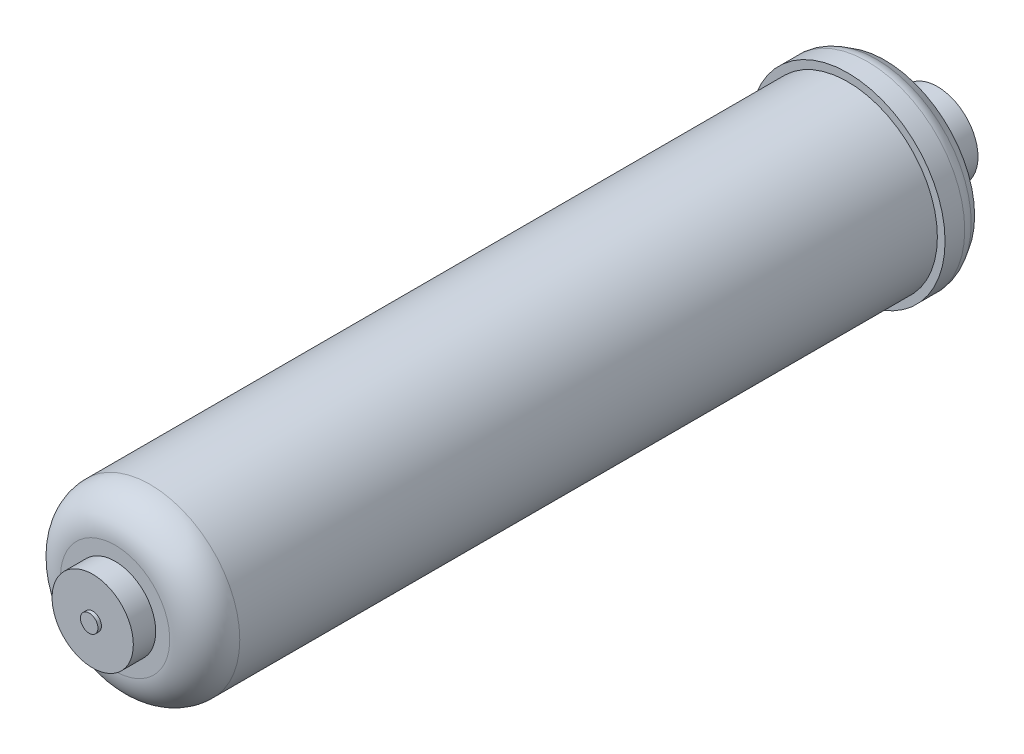
ISO-10303-21;
HEADER;
FILE_DESCRIPTION(('STEP AP214'),'2;1');
FILE_NAME('part.step','',(''),(''),'','','');
FILE_SCHEMA(('AUTOMOTIVE_DESIGN { 1 0 10303 214 1 1 1 1 }'));
ENDSEC;
DATA;
#1=APPLICATION_CONTEXT('core data for automotive mechanical design processes');
#2=APPLICATION_PROTOCOL_DEFINITION('international standard','automotive_design',2000,#1);
#3=PRODUCT_CONTEXT('',#1,'mechanical');
#4=PRODUCT('Part','Part','',(#3));
#5=PRODUCT_RELATED_PRODUCT_CATEGORY('part','',(#4));
#6=PRODUCT_DEFINITION_FORMATION('','',#4);
#7=PRODUCT_DEFINITION_CONTEXT('part definition',#1,'design');
#8=PRODUCT_DEFINITION('design','',#6,#7);
#9=PRODUCT_DEFINITION_SHAPE('','',#8);
#10=(LENGTH_UNIT() NAMED_UNIT(*) SI_UNIT(.MILLI.,.METRE.));
#11=(NAMED_UNIT(*) PLANE_ANGLE_UNIT() SI_UNIT($,.RADIAN.));
#12=(NAMED_UNIT(*) SI_UNIT($,.STERADIAN.) SOLID_ANGLE_UNIT());
#13=UNCERTAINTY_MEASURE_WITH_UNIT(LENGTH_MEASURE(1.E-05),#10,'distance_accuracy_value','');
#14=(GEOMETRIC_REPRESENTATION_CONTEXT(3) GLOBAL_UNCERTAINTY_ASSIGNED_CONTEXT((#13)) GLOBAL_UNIT_ASSIGNED_CONTEXT((#10,
#11,#12)) REPRESENTATION_CONTEXT('',''));
#15=CARTESIAN_POINT('',(0.,0.,0.));
#16=DIRECTION('',(0.,0.,1.));
#17=DIRECTION('',(1.,0.,0.));
#18=AXIS2_PLACEMENT_3D('',#15,#16,#17);
#19=CARTESIAN_POINT('',(0.,0.,0.));
#20=DIRECTION('',(0.,0.,-1.));
#21=DIRECTION('',(-1.,0.,0.));
#22=AXIS2_PLACEMENT_3D('',#19,#20,#21);
#23=PLANE('',#22);
#24=CARTESIAN_POINT('',(0.,0.,0.));
#25=DIRECTION('',(0.,0.,1.));
#26=DIRECTION('',(1.,0.,0.));
#27=AXIS2_PLACEMENT_3D('',#24,#25,#26);
#28=CIRCLE('',#27,3.175);
#29=CARTESIAN_POINT('',(3.175,0.,0.));
#30=VERTEX_POINT('',#29);
#31=EDGE_CURVE('E52',#30,#30,#28,.T.);
#32=ORIENTED_EDGE('',*,*,#31,.T.);
#33=EDGE_LOOP('',(#32));
#34=FACE_BOUND('',#33,.T.);
#35=ADVANCED_FACE('F32',(#34),#23,.F.);
#36=CARTESIAN_POINT('',(0.,0.,0.));
#37=DIRECTION('',(0.,0.,1.));
#38=DIRECTION('',(1.,0.,0.));
#39=AXIS2_PLACEMENT_3D('',#36,#37,#38);
#40=CYLINDRICAL_SURFACE('',#39,3.175);
#41=ORIENTED_EDGE('',*,*,#31,.F.);
#42=EDGE_LOOP('',(#41));
#43=FACE_BOUND('',#42,.T.);
#44=CARTESIAN_POINT('',(0.,0.,-1.27));
#45=DIRECTION('',(0.,0.,1.));
#46=DIRECTION('',(1.,0.,0.));
#47=AXIS2_PLACEMENT_3D('',#44,#45,#46);
#48=CIRCLE('',#47,3.175);
#49=CARTESIAN_POINT('',(3.175,0.,-1.27));
#50=VERTEX_POINT('',#49);
#51=EDGE_CURVE('E55',#50,#50,#48,.T.);
#52=ORIENTED_EDGE('',*,*,#51,.T.);
#53=EDGE_LOOP('',(#52));
#54=FACE_BOUND('',#53,.T.);
#55=ADVANCED_FACE('F101',(#43,#54),#40,.T.);
#56=CARTESIAN_POINT('',(0.,3.175,-1.27));
#57=DIRECTION('',(0.,0.,-1.));
#58=DIRECTION('',(-1.,0.,0.));
#59=AXIS2_PLACEMENT_3D('',#56,#57,#58);
#60=PLANE('',#59);
#61=ORIENTED_EDGE('',*,*,#51,.F.);
#62=EDGE_LOOP('',(#61));
#63=FACE_BOUND('',#62,.T.);
#64=CARTESIAN_POINT('',(0.,0.,-1.27));
#65=DIRECTION('',(0.,0.,1.));
#66=DIRECTION('',(1.,0.,0.));
#67=AXIS2_PLACEMENT_3D('',#64,#65,#66);
#68=CIRCLE('',#67,14.732);
#69=CARTESIAN_POINT('',(14.732,0.,-1.27));
#70=VERTEX_POINT('',#69);
#71=EDGE_CURVE('E58',#70,#70,#68,.T.);
#72=ORIENTED_EDGE('',*,*,#71,.T.);
#73=EDGE_LOOP('',(#72));
#74=FACE_BOUND('',#73,.T.);
#75=ADVANCED_FACE('F107',(#63,#74),#60,.F.);
#76=CARTESIAN_POINT('',(0.,0.,0.));
#77=DIRECTION('',(0.,0.,1.));
#78=DIRECTION('',(1.,0.,0.));
#79=AXIS2_PLACEMENT_3D('',#76,#77,#78);
#80=CYLINDRICAL_SURFACE('',#79,14.732);
#81=ORIENTED_EDGE('',*,*,#71,.F.);
#82=EDGE_LOOP('',(#81));
#83=FACE_BOUND('',#82,.T.);
#84=CARTESIAN_POINT('',(0.,0.,-9.398));
#85=DIRECTION('',(0.,0.,1.));
#86=DIRECTION('',(1.,0.,0.));
#87=AXIS2_PLACEMENT_3D('',#84,#85,#86);
#88=CIRCLE('',#87,14.732);
#89=CARTESIAN_POINT('',(14.732,0.,-9.398));
#90=VERTEX_POINT('',#89);
#91=EDGE_CURVE('E61',#90,#90,#88,.T.);
#92=ORIENTED_EDGE('',*,*,#91,.T.);
#93=EDGE_LOOP('',(#92));
#94=FACE_BOUND('',#93,.T.);
#95=ADVANCED_FACE('F113',(#83,#94),#80,.T.);
#96=CARTESIAN_POINT('',(0.,14.732,-9.398));
#97=DIRECTION('',(0.,0.,-1.));
#98=DIRECTION('',(-1.,0.,0.));
#99=AXIS2_PLACEMENT_3D('',#96,#97,#98);
#100=PLANE('',#99);
#101=CARTESIAN_POINT('',(0.,0.,-9.398));
#102=DIRECTION('',(0.,0.,-1.));
#103=DIRECTION('',(-1.,0.,0.));
#104=AXIS2_PLACEMENT_3D('',#101,#102,#103);
#105=CIRCLE('',#104,19.812);
#106=CARTESIAN_POINT('',(-19.812,0.,-9.398));
#107=VERTEX_POINT('',#106);
#108=EDGE_CURVE('E47',#107,#107,#105,.F.);
#109=ORIENTED_EDGE('',*,*,#108,.T.);
#110=EDGE_LOOP('',(#109));
#111=FACE_BOUND('',#110,.T.);
#112=ORIENTED_EDGE('',*,*,#91,.F.);
#113=EDGE_LOOP('',(#112));
#114=FACE_BOUND('',#113,.T.);
#115=ADVANCED_FACE('F117',(#111,#114),#100,.F.);
#116=CARTESIAN_POINT('',(0.,0.,0.));
#117=DIRECTION('',(0.,0.,1.));
#118=DIRECTION('',(1.,0.,0.));
#119=AXIS2_PLACEMENT_3D('',#116,#117,#118);
#120=CYLINDRICAL_SURFACE('',#119,32.512);
#121=CARTESIAN_POINT('',(0.,0.,-22.098));
#122=DIRECTION('',(0.,0.,-1.));
#123=DIRECTION('',(-1.,0.,0.));
#124=AXIS2_PLACEMENT_3D('',#121,#122,#123);
#125=CIRCLE('',#124,32.512);
#126=CARTESIAN_POINT('',(-32.512,0.,-22.098));
#127=VERTEX_POINT('',#126);
#128=EDGE_CURVE('E43',#127,#127,#125,.T.);
#129=ORIENTED_EDGE('',*,*,#128,.T.);
#130=EDGE_LOOP('',(#129));
#131=FACE_BOUND('',#130,.T.);
#132=CARTESIAN_POINT('',(0.,0.,-275.082));
#133=DIRECTION('',(0.,0.,1.));
#134=DIRECTION('',(1.,0.,0.));
#135=AXIS2_PLACEMENT_3D('',#132,#133,#134);
#136=CIRCLE('',#135,32.512);
#137=CARTESIAN_POINT('',(32.512,0.,-275.082));
#138=VERTEX_POINT('',#137);
#139=EDGE_CURVE('E64',#138,#138,#136,.T.);
#140=ORIENTED_EDGE('',*,*,#139,.T.);
#141=EDGE_LOOP('',(#140));
#142=FACE_BOUND('',#141,.T.);
#143=ADVANCED_FACE('F121',(#131,#142),#120,.T.);
#144=CARTESIAN_POINT('',(0.,32.512,-275.082));
#145=DIRECTION('',(0.,0.,-1.));
#146=DIRECTION('',(-1.,0.,0.));
#147=AXIS2_PLACEMENT_3D('',#144,#145,#146);
#148=PLANE('',#147);
#149=ORIENTED_EDGE('',*,*,#139,.F.);
#150=EDGE_LOOP('',(#149));
#151=FACE_BOUND('',#150,.T.);
#152=CARTESIAN_POINT('',(0.,0.,-275.082));
#153=DIRECTION('',(0.,0.,1.));
#154=DIRECTION('',(1.,0.,0.));
#155=AXIS2_PLACEMENT_3D('',#152,#153,#154);
#156=CIRCLE('',#155,35.306);
#157=CARTESIAN_POINT('',(35.306,0.,-275.082));
#158=VERTEX_POINT('',#157);
#159=EDGE_CURVE('E67',#158,#158,#156,.T.);
#160=ORIENTED_EDGE('',*,*,#159,.T.);
#161=EDGE_LOOP('',(#160));
#162=FACE_BOUND('',#161,.T.);
#163=ADVANCED_FACE('F125',(#151,#162),#148,.F.);
#164=CARTESIAN_POINT('',(0.,0.,0.));
#165=DIRECTION('',(0.,0.,1.));
#166=DIRECTION('',(1.,0.,0.));
#167=AXIS2_PLACEMENT_3D('',#164,#165,#166);
#168=CYLINDRICAL_SURFACE('',#167,35.306);
#169=CARTESIAN_POINT('',(0.,0.,-282.2089120975));
#170=DIRECTION('',(0.,0.,-1.));
#171=DIRECTION('',(-1.,0.,0.));
#172=AXIS2_PLACEMENT_3D('',#169,#170,#171);
#173=CIRCLE('',#172,35.306);
#174=CARTESIAN_POINT('',(-35.306,0.,-282.2089120975));
#175=VERTEX_POINT('',#174);
#176=EDGE_CURVE('E39',#175,#175,#173,.F.);
#177=ORIENTED_EDGE('',*,*,#176,.T.);
#178=EDGE_LOOP('',(#177));
#179=FACE_BOUND('',#178,.T.);
#180=ORIENTED_EDGE('',*,*,#159,.F.);
#181=EDGE_LOOP('',(#180));
#182=FACE_BOUND('',#181,.T.);
#183=ADVANCED_FACE('F129',(#179,#182),#168,.T.);
#184=CARTESIAN_POINT('',(0.,0.,-288.544));
#185=DIRECTION('',(0.,0.,1.));
#186=DIRECTION('',(1.,0.,0.));
#187=AXIS2_PLACEMENT_3D('',#184,#185,#186);
#188=CONICAL_SURFACE('',#187,32.5550841268207,0.541659485455934);
#189=CARTESIAN_POINT('',(0.,0.,-285.482709449718));
#190=DIRECTION('',(0.,0.,-1.));
#191=DIRECTION('',(-1.,0.,0.));
#192=AXIS2_PLACEMENT_3D('',#189,#190,#191);
#193=CIRCLE('',#192,34.3970248020577);
#194=CARTESIAN_POINT('',(-34.3970248020577,0.,-285.482709449718));
#195=VERTEX_POINT('',#194);
#196=EDGE_CURVE('E10',#195,#195,#193,.T.);
#197=ORIENTED_EDGE('',*,*,#196,.T.);
#198=EDGE_LOOP('',(#197));
#199=FACE_BOUND('',#198,.T.);
#200=CARTESIAN_POINT('',(0.,0.,-288.544));
#201=DIRECTION('',(0.,0.,1.));
#202=DIRECTION('',(1.,0.,0.));
#203=AXIS2_PLACEMENT_3D('',#200,#201,#202);
#204=CIRCLE('',#203,32.5550841268207);
#205=CARTESIAN_POINT('',(32.5550841268207,0.,-288.544));
#206=VERTEX_POINT('',#205);
#207=EDGE_CURVE('E70',#206,#206,#204,.T.);
#208=ORIENTED_EDGE('',*,*,#207,.T.);
#209=EDGE_LOOP('',(#208));
#210=FACE_BOUND('',#209,.T.);
#211=ADVANCED_FACE('F133',(#199,#210),#188,.T.);
#212=CARTESIAN_POINT('',(0.,0.,-299.466));
#213=DIRECTION('',(0.,0.,1.));
#214=DIRECTION('',(1.,0.,0.));
#215=AXIS2_PLACEMENT_3D('',#212,#213,#214);
#216=CONICAL_SURFACE('',#215,14.732,1.02101761241668);
#217=ORIENTED_EDGE('',*,*,#207,.F.);
#218=EDGE_LOOP('',(#217));
#219=FACE_BOUND('',#218,.T.);
#220=CARTESIAN_POINT('',(0.,0.,-299.466));
#221=DIRECTION('',(0.,0.,1.));
#222=DIRECTION('',(1.,0.,0.));
#223=AXIS2_PLACEMENT_3D('',#220,#221,#222);
#224=CIRCLE('',#223,14.732);
#225=CARTESIAN_POINT('',(14.732,0.,-299.466));
#226=VERTEX_POINT('',#225);
#227=EDGE_CURVE('E73',#226,#226,#224,.T.);
#228=ORIENTED_EDGE('',*,*,#227,.T.);
#229=EDGE_LOOP('',(#228));
#230=FACE_BOUND('',#229,.T.);
#231=ADVANCED_FACE('F136',(#219,#230),#216,.T.);
#232=CARTESIAN_POINT('',(0.,0.,0.));
#233=DIRECTION('',(0.,0.,1.));
#234=DIRECTION('',(1.,0.,0.));
#235=AXIS2_PLACEMENT_3D('',#232,#233,#234);
#236=CYLINDRICAL_SURFACE('',#235,14.732);
#237=ORIENTED_EDGE('',*,*,#227,.F.);
#238=EDGE_LOOP('',(#237));
#239=FACE_BOUND('',#238,.T.);
#240=CARTESIAN_POINT('',(0.,0.,-307.594));
#241=DIRECTION('',(0.,0.,1.));
#242=DIRECTION('',(1.,0.,0.));
#243=AXIS2_PLACEMENT_3D('',#240,#241,#242);
#244=CIRCLE('',#243,14.732);
#245=CARTESIAN_POINT('',(14.732,0.,-307.594));
#246=VERTEX_POINT('',#245);
#247=EDGE_CURVE('E76',#246,#246,#244,.T.);
#248=ORIENTED_EDGE('',*,*,#247,.T.);
#249=EDGE_LOOP('',(#248));
#250=FACE_BOUND('',#249,.T.);
#251=ADVANCED_FACE('F139',(#239,#250),#236,.T.);
#252=CARTESIAN_POINT('',(0.,14.732,-307.594));
#253=DIRECTION('',(0.,0.,1.));
#254=DIRECTION('',(1.,0.,0.));
#255=AXIS2_PLACEMENT_3D('',#252,#253,#254);
#256=PLANE('',#255);
#257=ORIENTED_EDGE('',*,*,#247,.F.);
#258=EDGE_LOOP('',(#257));
#259=FACE_BOUND('',#258,.T.);
#260=CARTESIAN_POINT('',(0.,0.,-307.594));
#261=DIRECTION('',(0.,0.,1.));
#262=DIRECTION('',(1.,0.,0.));
#263=AXIS2_PLACEMENT_3D('',#260,#261,#262);
#264=CIRCLE('',#263,3.175);
#265=CARTESIAN_POINT('',(3.175,0.,-307.594));
#266=VERTEX_POINT('',#265);
#267=EDGE_CURVE('E79',#266,#266,#264,.T.);
#268=ORIENTED_EDGE('',*,*,#267,.T.);
#269=EDGE_LOOP('',(#268));
#270=FACE_BOUND('',#269,.T.);
#271=ADVANCED_FACE('F97',(#259,#270),#256,.F.);
#272=CARTESIAN_POINT('',(0.,0.,0.));
#273=DIRECTION('',(0.,0.,1.));
#274=DIRECTION('',(1.,0.,0.));
#275=AXIS2_PLACEMENT_3D('',#272,#273,#274);
#276=CYLINDRICAL_SURFACE('',#275,3.175);
#277=ORIENTED_EDGE('',*,*,#267,.F.);
#278=EDGE_LOOP('',(#277));
#279=FACE_BOUND('',#278,.T.);
#280=CARTESIAN_POINT('',(0.,0.,-308.864));
#281=DIRECTION('',(0.,0.,1.));
#282=DIRECTION('',(1.,0.,0.));
#283=AXIS2_PLACEMENT_3D('',#280,#281,#282);
#284=CIRCLE('',#283,3.175);
#285=CARTESIAN_POINT('',(3.175,0.,-308.864));
#286=VERTEX_POINT('',#285);
#287=EDGE_CURVE('E82',#286,#286,#284,.T.);
#288=ORIENTED_EDGE('',*,*,#287,.T.);
#289=EDGE_LOOP('',(#288));
#290=FACE_BOUND('',#289,.T.);
#291=ADVANCED_FACE('F86',(#279,#290),#276,.T.);
#292=CARTESIAN_POINT('',(0.,3.175,-308.864));
#293=DIRECTION('',(0.,0.,1.));
#294=DIRECTION('',(1.,0.,0.));
#295=AXIS2_PLACEMENT_3D('',#292,#293,#294);
#296=PLANE('',#295);
#297=ORIENTED_EDGE('',*,*,#287,.F.);
#298=EDGE_LOOP('',(#297));
#299=FACE_BOUND('',#298,.T.);
#300=ADVANCED_FACE('F88',(#299),#296,.F.);
#301=CARTESIAN_POINT('',(0.,0.,-22.098));
#302=DIRECTION('',(0.,0.,-1.));
#303=DIRECTION('',(-1.,0.,0.));
#304=AXIS2_PLACEMENT_3D('',#301,#302,#303);
#305=TOROIDAL_SURFACE('',#304,19.812,12.7);
#306=ORIENTED_EDGE('',*,*,#128,.F.);
#307=EDGE_LOOP('',(#306));
#308=FACE_BOUND('',#307,.T.);
#309=ORIENTED_EDGE('',*,*,#108,.F.);
#310=EDGE_LOOP('',(#309));
#311=FACE_BOUND('',#310,.T.);
#312=ADVANCED_FACE('F90',(#308,#311),#305,.T.);
#313=CARTESIAN_POINT('',(0.,0.,-282.2089120975));
#314=DIRECTION('',(0.,0.,-1.));
#315=DIRECTION('',(-1.,0.,0.));
#316=AXIS2_PLACEMENT_3D('',#313,#314,#315);
#317=TOROIDAL_SURFACE('',#316,28.956,6.35);
#318=ORIENTED_EDGE('',*,*,#196,.F.);
#319=EDGE_LOOP('',(#318));
#320=FACE_BOUND('',#319,.T.);
#321=ORIENTED_EDGE('',*,*,#176,.F.);
#322=EDGE_LOOP('',(#321));
#323=FACE_BOUND('',#322,.T.);
#324=ADVANCED_FACE('F34',(#320,#323),#317,.T.);
#325=CLOSED_SHELL('',(#35,#55,#75,#95,#115,#143,#163,#183,#211,#231,#251,#271,#291,#300,#312,#324));
#326=MANIFOLD_SOLID_BREP('B2',#325);
#327=ADVANCED_BREP_SHAPE_REPRESENTATION('',(#18,#326),#14);
#328=SHAPE_DEFINITION_REPRESENTATION(#9,#327);
ENDSEC;
END-ISO-10303-21;
